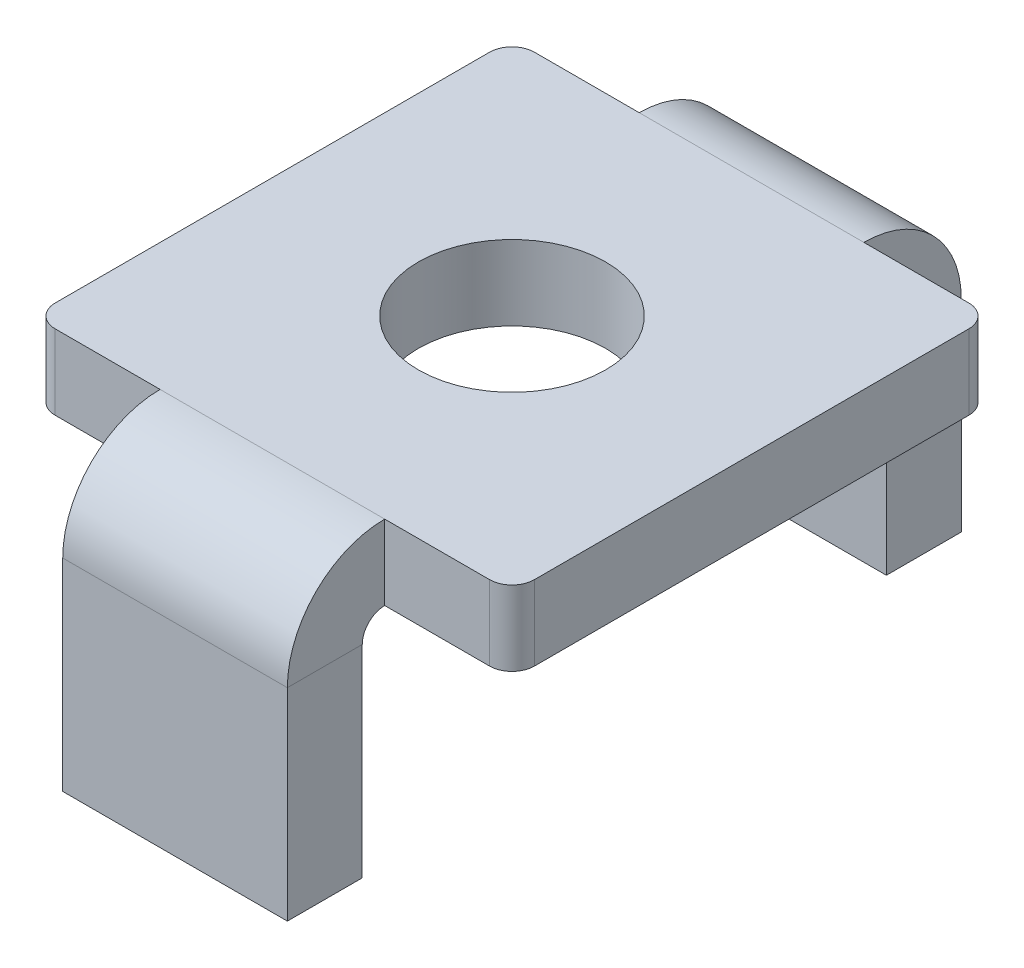
ISO-10303-21;
HEADER;
FILE_DESCRIPTION(('STEP AP214'),'2;1');
FILE_NAME('part.step','',(''),(''),'','','');
FILE_SCHEMA(('AUTOMOTIVE_DESIGN { 1 0 10303 214 1 1 1 1 }'));
ENDSEC;
DATA;
#1=APPLICATION_CONTEXT('core data for automotive mechanical design processes');
#2=APPLICATION_PROTOCOL_DEFINITION('international standard','automotive_design',2000,#1);
#3=PRODUCT_CONTEXT('',#1,'mechanical');
#4=PRODUCT('Part','Part','',(#3));
#5=PRODUCT_RELATED_PRODUCT_CATEGORY('part','',(#4));
#6=PRODUCT_DEFINITION_FORMATION('','',#4);
#7=PRODUCT_DEFINITION_CONTEXT('part definition',#1,'design');
#8=PRODUCT_DEFINITION('design','',#6,#7);
#9=PRODUCT_DEFINITION_SHAPE('','',#8);
#10=(LENGTH_UNIT() NAMED_UNIT(*) SI_UNIT(.MILLI.,.METRE.));
#11=(NAMED_UNIT(*) PLANE_ANGLE_UNIT() SI_UNIT($,.RADIAN.));
#12=(NAMED_UNIT(*) SI_UNIT($,.STERADIAN.) SOLID_ANGLE_UNIT());
#13=UNCERTAINTY_MEASURE_WITH_UNIT(LENGTH_MEASURE(1.E-05),#10,'distance_accuracy_value','');
#14=(GEOMETRIC_REPRESENTATION_CONTEXT(3) GLOBAL_UNCERTAINTY_ASSIGNED_CONTEXT((#13)) GLOBAL_UNIT_ASSIGNED_CONTEXT((#10,
#11,#12)) REPRESENTATION_CONTEXT('',''));
#15=CARTESIAN_POINT('',(0.,0.,0.));
#16=DIRECTION('',(0.,0.,1.));
#17=DIRECTION('',(1.,0.,0.));
#18=AXIS2_PLACEMENT_3D('',#15,#16,#17);
#19=CARTESIAN_POINT('',(-3.2,0.,-3.2));
#20=DIRECTION('',(0.,0.,-1.));
#21=DIRECTION('',(-1.,0.,0.));
#22=AXIS2_PLACEMENT_3D('',#19,#20,#21);
#23=PLANE('',#22);
#24=DIRECTION('',(1.,0.,0.));
#25=VECTOR('',#24,1.);
#26=CARTESIAN_POINT('',(0.,1.,-3.2));
#27=LINE('',#26,#25);
#28=CARTESIAN_POINT('',(2.9,1.,-3.2));
#29=VERTEX_POINT('',#28);
#30=CARTESIAN_POINT('',(1.5,1.,-3.2));
#31=VERTEX_POINT('',#30);
#32=EDGE_CURVE('E338',#29,#31,#27,.F.);
#33=ORIENTED_EDGE('',*,*,#32,.F.);
#34=DIRECTION('',(0.,-1.,0.));
#35=VECTOR('',#34,1.);
#36=CARTESIAN_POINT('',(2.9,0.,-3.2));
#37=LINE('',#36,#35);
#38=CARTESIAN_POINT('',(2.9,0.,-3.2));
#39=VERTEX_POINT('',#38);
#40=EDGE_CURVE('E384',#29,#39,#37,.T.);
#41=ORIENTED_EDGE('',*,*,#40,.T.);
#42=DIRECTION('',(-1.,0.,0.));
#43=VECTOR('',#42,1.);
#44=CARTESIAN_POINT('',(-3.2,0.,-3.2));
#45=LINE('',#44,#43);
#46=CARTESIAN_POINT('',(1.5,0.,-3.2));
#47=VERTEX_POINT('',#46);
#48=EDGE_CURVE('E348',#39,#47,#45,.T.);
#49=ORIENTED_EDGE('',*,*,#48,.T.);
#50=DIRECTION('',(0.,1.,0.));
#51=VECTOR('',#50,1.);
#52=CARTESIAN_POINT('',(1.5,0.,-3.2));
#53=LINE('',#52,#51);
#54=EDGE_CURVE('E266',#47,#31,#53,.T.);
#55=ORIENTED_EDGE('',*,*,#54,.T.);
#56=EDGE_LOOP('',(#33,#41,#49,#55));
#57=FACE_BOUND('',#56,.T.);
#58=ADVANCED_FACE('F78',(#57),#23,.T.);
#59=CARTESIAN_POINT('',(-3.2,0.,3.2));
#60=DIRECTION('',(0.,0.,1.));
#61=DIRECTION('',(1.,0.,0.));
#62=AXIS2_PLACEMENT_3D('',#59,#60,#61);
#63=PLANE('',#62);
#64=DIRECTION('',(1.,0.,0.));
#65=VECTOR('',#64,1.);
#66=CARTESIAN_POINT('',(0.,1.,3.2));
#67=LINE('',#66,#65);
#68=CARTESIAN_POINT('',(-2.9,1.,3.2));
#69=VERTEX_POINT('',#68);
#70=CARTESIAN_POINT('',(-1.5,1.,3.2));
#71=VERTEX_POINT('',#70);
#72=EDGE_CURVE('E361',#69,#71,#67,.T.);
#73=ORIENTED_EDGE('',*,*,#72,.F.);
#74=DIRECTION('',(0.,-1.,0.));
#75=VECTOR('',#74,1.);
#76=CARTESIAN_POINT('',(-2.9,0.,3.2));
#77=LINE('',#76,#75);
#78=CARTESIAN_POINT('',(-2.9,0.,3.2));
#79=VERTEX_POINT('',#78);
#80=EDGE_CURVE('E13',#69,#79,#77,.T.);
#81=ORIENTED_EDGE('',*,*,#80,.T.);
#82=DIRECTION('',(1.,0.,0.));
#83=VECTOR('',#82,1.);
#84=CARTESIAN_POINT('',(-3.2,0.,3.2));
#85=LINE('',#84,#83);
#86=CARTESIAN_POINT('',(-1.5,0.,3.2));
#87=VERTEX_POINT('',#86);
#88=EDGE_CURVE('E342',#79,#87,#85,.T.);
#89=ORIENTED_EDGE('',*,*,#88,.T.);
#90=DIRECTION('',(0.,1.,0.));
#91=VECTOR('',#90,1.);
#92=CARTESIAN_POINT('',(-1.5,0.,3.2));
#93=LINE('',#92,#91);
#94=EDGE_CURVE('E319',#87,#71,#93,.T.);
#95=ORIENTED_EDGE('',*,*,#94,.T.);
#96=EDGE_LOOP('',(#73,#81,#89,#95));
#97=FACE_BOUND('',#96,.T.);
#98=ADVANCED_FACE('F449',(#97),#63,.T.);
#99=CARTESIAN_POINT('',(-3.2,0.,-3.2));
#100=DIRECTION('',(-1.,0.,0.));
#101=DIRECTION('',(0.,0.,1.));
#102=AXIS2_PLACEMENT_3D('',#99,#100,#101);
#103=PLANE('',#102);
#104=DIRECTION('',(0.,0.,1.));
#105=VECTOR('',#104,1.);
#106=CARTESIAN_POINT('',(-3.2,1.,0.));
#107=LINE('',#106,#105);
#108=CARTESIAN_POINT('',(-3.2,1.,-2.9));
#109=VERTEX_POINT('',#108);
#110=CARTESIAN_POINT('',(-3.2,1.,2.9));
#111=VERTEX_POINT('',#110);
#112=EDGE_CURVE('E359',#109,#111,#107,.T.);
#113=ORIENTED_EDGE('',*,*,#112,.F.);
#114=DIRECTION('',(0.,-1.,0.));
#115=VECTOR('',#114,1.);
#116=CARTESIAN_POINT('',(-3.2,0.,-2.9));
#117=LINE('',#116,#115);
#118=CARTESIAN_POINT('',(-3.2,0.,-2.9));
#119=VERTEX_POINT('',#118);
#120=EDGE_CURVE('E364',#109,#119,#117,.T.);
#121=ORIENTED_EDGE('',*,*,#120,.T.);
#122=DIRECTION('',(0.,0.,1.));
#123=VECTOR('',#122,1.);
#124=CARTESIAN_POINT('',(-3.2,0.,-3.2));
#125=LINE('',#124,#123);
#126=CARTESIAN_POINT('',(-3.2,0.,2.9));
#127=VERTEX_POINT('',#126);
#128=EDGE_CURVE('E344',#119,#127,#125,.T.);
#129=ORIENTED_EDGE('',*,*,#128,.T.);
#130=DIRECTION('',(0.,-1.,0.));
#131=VECTOR('',#130,1.);
#132=CARTESIAN_POINT('',(-3.2,0.,2.9));
#133=LINE('',#132,#131);
#134=EDGE_CURVE('E350',#127,#111,#133,.F.);
#135=ORIENTED_EDGE('',*,*,#134,.T.);
#136=EDGE_LOOP('',(#113,#121,#129,#135));
#137=FACE_BOUND('',#136,.T.);
#138=ADVANCED_FACE('F454',(#137),#103,.T.);
#139=CARTESIAN_POINT('',(-1.5,0.,-3.2));
#140=VERTEX_POINT('',#139);
#141=CARTESIAN_POINT('',(-2.9,0.,-3.2));
#142=VERTEX_POINT('',#141);
#143=EDGE_CURVE('E347',#140,#142,#45,.T.);
#144=ORIENTED_EDGE('',*,*,#143,.T.);
#145=DIRECTION('',(0.,-1.,0.));
#146=VECTOR('',#145,1.);
#147=CARTESIAN_POINT('',(-2.9,0.,-3.2));
#148=LINE('',#147,#146);
#149=CARTESIAN_POINT('',(-2.9,1.,-3.2));
#150=VERTEX_POINT('',#149);
#151=EDGE_CURVE('E375',#142,#150,#148,.F.);
#152=ORIENTED_EDGE('',*,*,#151,.T.);
#153=CARTESIAN_POINT('',(-1.5,1.,-3.2));
#154=VERTEX_POINT('',#153);
#155=EDGE_CURVE('E358',#154,#150,#27,.F.);
#156=ORIENTED_EDGE('',*,*,#155,.F.);
#157=DIRECTION('',(0.,1.,0.));
#158=VECTOR('',#157,1.);
#159=CARTESIAN_POINT('',(-1.5,0.,-3.2));
#160=LINE('',#159,#158);
#161=EDGE_CURVE('E277',#140,#154,#160,.T.);
#162=ORIENTED_EDGE('',*,*,#161,.F.);
#163=EDGE_LOOP('',(#144,#152,#156,#162));
#164=FACE_BOUND('',#163,.T.);
#165=ADVANCED_FACE('F425',(#164),#23,.T.);
#166=CARTESIAN_POINT('',(3.2,0.,-3.2));
#167=DIRECTION('',(1.,0.,0.));
#168=DIRECTION('',(0.,0.,-1.));
#169=AXIS2_PLACEMENT_3D('',#166,#167,#168);
#170=PLANE('',#169);
#171=DIRECTION('',(0.,0.,-1.));
#172=VECTOR('',#171,1.);
#173=CARTESIAN_POINT('',(3.2,0.,-3.2));
#174=LINE('',#173,#172);
#175=CARTESIAN_POINT('',(3.2,0.,2.9));
#176=VERTEX_POINT('',#175);
#177=CARTESIAN_POINT('',(3.2,0.,-2.9));
#178=VERTEX_POINT('',#177);
#179=EDGE_CURVE('E337',#176,#178,#174,.T.);
#180=ORIENTED_EDGE('',*,*,#179,.T.);
#181=DIRECTION('',(0.,-1.,0.));
#182=VECTOR('',#181,1.);
#183=CARTESIAN_POINT('',(3.2,0.,-2.9));
#184=LINE('',#183,#182);
#185=CARTESIAN_POINT('',(3.2,1.,-2.9));
#186=VERTEX_POINT('',#185);
#187=EDGE_CURVE('E390',#178,#186,#184,.F.);
#188=ORIENTED_EDGE('',*,*,#187,.T.);
#189=DIRECTION('',(0.,0.,1.));
#190=VECTOR('',#189,1.);
#191=CARTESIAN_POINT('',(3.2,1.,0.));
#192=LINE('',#191,#190);
#193=CARTESIAN_POINT('',(3.2,1.,2.9));
#194=VERTEX_POINT('',#193);
#195=EDGE_CURVE('E353',#194,#186,#192,.F.);
#196=ORIENTED_EDGE('',*,*,#195,.F.);
#197=DIRECTION('',(0.,-1.,0.));
#198=VECTOR('',#197,1.);
#199=CARTESIAN_POINT('',(3.2,0.,2.9));
#200=LINE('',#199,#198);
#201=EDGE_CURVE('E387',#194,#176,#200,.T.);
#202=ORIENTED_EDGE('',*,*,#201,.T.);
#203=EDGE_LOOP('',(#180,#188,#196,#202));
#204=FACE_BOUND('',#203,.T.);
#205=ADVANCED_FACE('F394',(#204),#170,.T.);
#206=CARTESIAN_POINT('',(0.,0.,0.));
#207=DIRECTION('',(0.,1.,0.));
#208=DIRECTION('',(0.,0.,1.));
#209=AXIS2_PLACEMENT_3D('',#206,#207,#208);
#210=CYLINDRICAL_SURFACE('',#209,1.25);
#211=CARTESIAN_POINT('',(0.,0.,0.));
#212=DIRECTION('',(0.,1.,0.));
#213=DIRECTION('',(0.,0.,1.));
#214=AXIS2_PLACEMENT_3D('',#211,#212,#213);
#215=CIRCLE('',#214,1.25);
#216=CARTESIAN_POINT('',(0.,0.,1.25));
#217=VERTEX_POINT('',#216);
#218=EDGE_CURVE('E334',#217,#217,#215,.T.);
#219=ORIENTED_EDGE('',*,*,#218,.F.);
#220=EDGE_LOOP('',(#219));
#221=FACE_BOUND('',#220,.T.);
#222=CARTESIAN_POINT('',(0.,1.,0.));
#223=DIRECTION('',(0.,1.,0.));
#224=DIRECTION('',(0.,0.,1.));
#225=AXIS2_PLACEMENT_3D('',#222,#223,#224);
#226=CIRCLE('',#225,1.25);
#227=CARTESIAN_POINT('',(0.,1.,1.25));
#228=VERTEX_POINT('',#227);
#229=EDGE_CURVE('E331',#228,#228,#226,.T.);
#230=ORIENTED_EDGE('',*,*,#229,.T.);
#231=EDGE_LOOP('',(#230));
#232=FACE_BOUND('',#231,.T.);
#233=ADVANCED_FACE('F465',(#221,#232),#210,.F.);
#234=CARTESIAN_POINT('',(1.5,0.,3.2));
#235=VERTEX_POINT('',#234);
#236=CARTESIAN_POINT('',(2.9,0.,3.2));
#237=VERTEX_POINT('',#236);
#238=EDGE_CURVE('E341',#235,#237,#85,.T.);
#239=ORIENTED_EDGE('',*,*,#238,.T.);
#240=DIRECTION('',(0.,-1.,0.));
#241=VECTOR('',#240,1.);
#242=CARTESIAN_POINT('',(2.9,0.,3.2));
#243=LINE('',#242,#241);
#244=CARTESIAN_POINT('',(2.9,1.,3.2));
#245=VERTEX_POINT('',#244);
#246=EDGE_CURVE('E86',#237,#245,#243,.F.);
#247=ORIENTED_EDGE('',*,*,#246,.T.);
#248=CARTESIAN_POINT('',(1.5,1.,3.2));
#249=VERTEX_POINT('',#248);
#250=EDGE_CURVE('E356',#249,#245,#67,.T.);
#251=ORIENTED_EDGE('',*,*,#250,.F.);
#252=DIRECTION('',(0.,1.,0.));
#253=VECTOR('',#252,1.);
#254=CARTESIAN_POINT('',(1.5,0.,3.2));
#255=LINE('',#254,#253);
#256=EDGE_CURVE('E329',#235,#249,#255,.T.);
#257=ORIENTED_EDGE('',*,*,#256,.F.);
#258=EDGE_LOOP('',(#239,#247,#251,#257));
#259=FACE_BOUND('',#258,.T.);
#260=ADVANCED_FACE('F457',(#259),#63,.T.);
#261=CARTESIAN_POINT('',(0.,0.,0.));
#262=DIRECTION('',(0.,1.,0.));
#263=DIRECTION('',(0.,0.,1.));
#264=AXIS2_PLACEMENT_3D('',#261,#262,#263);
#265=PLANE('',#264);
#266=ORIENTED_EDGE('',*,*,#218,.T.);
#267=EDGE_LOOP('',(#266));
#268=FACE_BOUND('',#267,.T.);
#269=ORIENTED_EDGE('',*,*,#128,.F.);
#270=CARTESIAN_POINT('',(-2.9,0.,-2.9));
#271=DIRECTION('',(0.,1.,0.));
#272=DIRECTION('',(0.,0.,1.));
#273=AXIS2_PLACEMENT_3D('',#270,#271,#272);
#274=CIRCLE('',#273,0.3);
#275=EDGE_CURVE('E373',#119,#142,#274,.F.);
#276=ORIENTED_EDGE('',*,*,#275,.T.);
#277=ORIENTED_EDGE('',*,*,#143,.F.);
#278=DIRECTION('',(1.,0.,0.));
#279=VECTOR('',#278,1.);
#280=CARTESIAN_POINT('',(1.5,0.,-3.2));
#281=LINE('',#280,#279);
#282=EDGE_CURVE('E272',#47,#140,#281,.F.);
#283=ORIENTED_EDGE('',*,*,#282,.F.);
#284=ORIENTED_EDGE('',*,*,#48,.F.);
#285=CARTESIAN_POINT('',(2.9,0.,-2.9));
#286=DIRECTION('',(0.,1.,0.));
#287=DIRECTION('',(0.,0.,1.));
#288=AXIS2_PLACEMENT_3D('',#285,#286,#287);
#289=CIRCLE('',#288,0.3);
#290=EDGE_CURVE('E371',#39,#178,#289,.F.);
#291=ORIENTED_EDGE('',*,*,#290,.T.);
#292=ORIENTED_EDGE('',*,*,#179,.F.);
#293=CARTESIAN_POINT('',(2.9,0.,2.9));
#294=DIRECTION('',(0.,1.,0.));
#295=DIRECTION('',(0.,0.,1.));
#296=AXIS2_PLACEMENT_3D('',#293,#294,#295);
#297=CIRCLE('',#296,0.3);
#298=EDGE_CURVE('E369',#176,#237,#297,.F.);
#299=ORIENTED_EDGE('',*,*,#298,.T.);
#300=ORIENTED_EDGE('',*,*,#238,.F.);
#301=DIRECTION('',(-1.,0.,0.));
#302=VECTOR('',#301,1.);
#303=CARTESIAN_POINT('',(-1.5,0.,3.2));
#304=LINE('',#303,#302);
#305=EDGE_CURVE('E325',#87,#235,#304,.F.);
#306=ORIENTED_EDGE('',*,*,#305,.F.);
#307=ORIENTED_EDGE('',*,*,#88,.F.);
#308=CARTESIAN_POINT('',(-2.9,0.,2.9));
#309=DIRECTION('',(0.,1.,0.));
#310=DIRECTION('',(0.,0.,1.));
#311=AXIS2_PLACEMENT_3D('',#308,#309,#310);
#312=CIRCLE('',#311,0.3);
#313=EDGE_CURVE('E367',#79,#127,#312,.F.);
#314=ORIENTED_EDGE('',*,*,#313,.T.);
#315=EDGE_LOOP('',(#269,#276,#277,#283,#284,#291,#292,#299,#300,#306,#307,#314));
#316=FACE_BOUND('',#315,.T.);
#317=ADVANCED_FACE('F411',(#268,#316),#265,.F.);
#318=CARTESIAN_POINT('',(0.,1.,0.));
#319=DIRECTION('',(0.,1.,0.));
#320=DIRECTION('',(0.,0.,1.));
#321=AXIS2_PLACEMENT_3D('',#318,#319,#320);
#322=PLANE('',#321);
#323=ORIENTED_EDGE('',*,*,#229,.F.);
#324=EDGE_LOOP('',(#323));
#325=FACE_BOUND('',#324,.T.);
#326=ORIENTED_EDGE('',*,*,#155,.T.);
#327=CARTESIAN_POINT('',(-2.9,1.,-2.9));
#328=DIRECTION('',(0.,1.,0.));
#329=DIRECTION('',(0.,0.,1.));
#330=AXIS2_PLACEMENT_3D('',#327,#328,#329);
#331=CIRCLE('',#330,0.3);
#332=EDGE_CURVE('E382',#150,#109,#331,.T.);
#333=ORIENTED_EDGE('',*,*,#332,.T.);
#334=ORIENTED_EDGE('',*,*,#112,.T.);
#335=CARTESIAN_POINT('',(-2.9,1.,2.9));
#336=DIRECTION('',(0.,1.,0.));
#337=DIRECTION('',(0.,0.,1.));
#338=AXIS2_PLACEMENT_3D('',#335,#336,#337);
#339=CIRCLE('',#338,0.3);
#340=EDGE_CURVE('E100',#111,#69,#339,.T.);
#341=ORIENTED_EDGE('',*,*,#340,.T.);
#342=ORIENTED_EDGE('',*,*,#72,.T.);
#343=DIRECTION('',(-1.,0.,0.));
#344=VECTOR('',#343,1.);
#345=CARTESIAN_POINT('',(-1.5,1.,3.2));
#346=LINE('',#345,#344);
#347=EDGE_CURVE('E312',#71,#249,#346,.F.);
#348=ORIENTED_EDGE('',*,*,#347,.T.);
#349=ORIENTED_EDGE('',*,*,#250,.T.);
#350=CARTESIAN_POINT('',(2.9,1.,2.9));
#351=DIRECTION('',(0.,1.,0.));
#352=DIRECTION('',(0.,0.,1.));
#353=AXIS2_PLACEMENT_3D('',#350,#351,#352);
#354=CIRCLE('',#353,0.3);
#355=EDGE_CURVE('E378',#245,#194,#354,.T.);
#356=ORIENTED_EDGE('',*,*,#355,.T.);
#357=ORIENTED_EDGE('',*,*,#195,.T.);
#358=CARTESIAN_POINT('',(2.9,1.,-2.9));
#359=DIRECTION('',(0.,1.,0.));
#360=DIRECTION('',(0.,0.,1.));
#361=AXIS2_PLACEMENT_3D('',#358,#359,#360);
#362=CIRCLE('',#361,0.3);
#363=EDGE_CURVE('E380',#186,#29,#362,.T.);
#364=ORIENTED_EDGE('',*,*,#363,.T.);
#365=ORIENTED_EDGE('',*,*,#32,.T.);
#366=DIRECTION('',(1.,0.,0.));
#367=VECTOR('',#366,1.);
#368=CARTESIAN_POINT('',(1.5,1.,-3.2));
#369=LINE('',#368,#367);
#370=EDGE_CURVE('E259',#31,#154,#369,.F.);
#371=ORIENTED_EDGE('',*,*,#370,.T.);
#372=EDGE_LOOP('',(#326,#333,#334,#341,#342,#348,#349,#356,#357,#364,#365,#371));
#373=FACE_BOUND('',#372,.T.);
#374=ADVANCED_FACE('F400',(#325,#373),#322,.T.);
#375=CARTESIAN_POINT('',(1.5,-0.299999999999998,3.2));
#376=DIRECTION('',(1.,0.,0.));
#377=DIRECTION('',(0.,0.,-1.));
#378=AXIS2_PLACEMENT_3D('',#375,#376,#377);
#379=PLANE('',#378);
#380=DIRECTION('',(0.,0.,-1.));
#381=VECTOR('',#380,1.);
#382=CARTESIAN_POINT('',(1.5,-0.299999999999998,4.5));
#383=LINE('',#382,#381);
#384=CARTESIAN_POINT('',(1.5,-0.299999999999997,3.5));
#385=VERTEX_POINT('',#384);
#386=CARTESIAN_POINT('',(1.5,-0.299999999999994,4.5));
#387=VERTEX_POINT('',#386);
#388=EDGE_CURVE('E279',#385,#387,#383,.F.);
#389=ORIENTED_EDGE('',*,*,#388,.F.);
#390=CARTESIAN_POINT('',(1.5,-0.299999999999998,3.2));
#391=DIRECTION('',(-1.,0.,0.));
#392=DIRECTION('',(0.,0.,1.));
#393=AXIS2_PLACEMENT_3D('',#390,#391,#392);
#394=CIRCLE('',#393,0.3);
#395=EDGE_CURVE('E322',#235,#385,#394,.F.);
#396=ORIENTED_EDGE('',*,*,#395,.F.);
#397=ORIENTED_EDGE('',*,*,#256,.T.);
#398=CARTESIAN_POINT('',(1.5,-0.299999999999998,3.2));
#399=DIRECTION('',(-1.,0.,0.));
#400=DIRECTION('',(0.,0.,1.));
#401=AXIS2_PLACEMENT_3D('',#398,#399,#400);
#402=CIRCLE('',#401,1.3);
#403=EDGE_CURVE('E315',#249,#387,#402,.F.);
#404=ORIENTED_EDGE('',*,*,#403,.T.);
#405=EDGE_LOOP('',(#389,#396,#397,#404));
#406=FACE_BOUND('',#405,.T.);
#407=ADVANCED_FACE('F489',(#406),#379,.T.);
#408=CARTESIAN_POINT('',(-1.5,-0.299999999999998,3.2));
#409=DIRECTION('',(1.,0.,0.));
#410=DIRECTION('',(0.,0.,-1.));
#411=AXIS2_PLACEMENT_3D('',#408,#409,#410);
#412=PLANE('',#411);
#413=CARTESIAN_POINT('',(-1.5,-0.299999999999998,3.2));
#414=DIRECTION('',(-1.,0.,0.));
#415=DIRECTION('',(0.,0.,1.));
#416=AXIS2_PLACEMENT_3D('',#413,#414,#415);
#417=CIRCLE('',#416,0.3);
#418=CARTESIAN_POINT('',(-1.5,-0.299999999999997,3.5));
#419=VERTEX_POINT('',#418);
#420=EDGE_CURVE('E285',#419,#87,#417,.T.);
#421=ORIENTED_EDGE('',*,*,#420,.F.);
#422=DIRECTION('',(0.,0.,-1.));
#423=VECTOR('',#422,1.);
#424=CARTESIAN_POINT('',(-1.5,-0.299999999999998,3.5));
#425=LINE('',#424,#423);
#426=CARTESIAN_POINT('',(-1.5,-0.299999999999998,4.5));
#427=VERTEX_POINT('',#426);
#428=EDGE_CURVE('E305',#419,#427,#425,.F.);
#429=ORIENTED_EDGE('',*,*,#428,.T.);
#430=CARTESIAN_POINT('',(-1.5,-0.299999999999998,3.2));
#431=DIRECTION('',(-1.,0.,0.));
#432=DIRECTION('',(0.,0.,1.));
#433=AXIS2_PLACEMENT_3D('',#430,#431,#432);
#434=CIRCLE('',#433,1.3);
#435=EDGE_CURVE('E316',#427,#71,#434,.T.);
#436=ORIENTED_EDGE('',*,*,#435,.T.);
#437=ORIENTED_EDGE('',*,*,#94,.F.);
#438=EDGE_LOOP('',(#421,#429,#436,#437));
#439=FACE_BOUND('',#438,.T.);
#440=ADVANCED_FACE('F533',(#439),#412,.F.);
#441=CARTESIAN_POINT('',(-1.5,-0.299999999999998,3.2));
#442=DIRECTION('',(-1.,0.,0.));
#443=DIRECTION('',(0.,0.,1.));
#444=AXIS2_PLACEMENT_3D('',#441,#442,#443);
#445=CYLINDRICAL_SURFACE('',#444,1.3);
#446=ORIENTED_EDGE('',*,*,#347,.F.);
#447=ORIENTED_EDGE('',*,*,#435,.F.);
#448=DIRECTION('',(-1.,0.,0.));
#449=VECTOR('',#448,1.);
#450=CARTESIAN_POINT('',(1.5,-0.299999999999998,4.5));
#451=LINE('',#450,#449);
#452=EDGE_CURVE('E303',#427,#387,#451,.F.);
#453=ORIENTED_EDGE('',*,*,#452,.T.);
#454=ORIENTED_EDGE('',*,*,#403,.F.);
#455=EDGE_LOOP('',(#446,#447,#453,#454));
#456=FACE_BOUND('',#455,.T.);
#457=ADVANCED_FACE('F492',(#456),#445,.T.);
#458=CARTESIAN_POINT('',(-1.5,-0.299999999999998,3.2));
#459=DIRECTION('',(-1.,0.,0.));
#460=DIRECTION('',(0.,0.,1.));
#461=AXIS2_PLACEMENT_3D('',#458,#459,#460);
#462=CYLINDRICAL_SURFACE('',#461,0.3);
#463=ORIENTED_EDGE('',*,*,#305,.T.);
#464=ORIENTED_EDGE('',*,*,#395,.T.);
#465=DIRECTION('',(-1.,0.,0.));
#466=VECTOR('',#465,1.);
#467=CARTESIAN_POINT('',(1.5,-0.299999999999998,3.5));
#468=LINE('',#467,#466);
#469=EDGE_CURVE('E308',#385,#419,#468,.T.);
#470=ORIENTED_EDGE('',*,*,#469,.T.);
#471=ORIENTED_EDGE('',*,*,#420,.T.);
#472=EDGE_LOOP('',(#463,#464,#470,#471));
#473=FACE_BOUND('',#472,.T.);
#474=ADVANCED_FACE('F513',(#473),#462,.F.);
#475=CARTESIAN_POINT('',(-1.5,-3.,4.50000000000001));
#476=DIRECTION('',(1.,0.,0.));
#477=DIRECTION('',(0.,0.,-1.));
#478=AXIS2_PLACEMENT_3D('',#475,#476,#477);
#479=PLANE('',#478);
#480=ORIENTED_EDGE('',*,*,#428,.F.);
#481=DIRECTION('',(0.,1.,0.));
#482=VECTOR('',#481,1.);
#483=CARTESIAN_POINT('',(-1.5,-3.,3.50000000000001));
#484=LINE('',#483,#482);
#485=CARTESIAN_POINT('',(-1.5,-3.,3.50000000000001));
#486=VERTEX_POINT('',#485);
#487=EDGE_CURVE('E301',#419,#486,#484,.F.);
#488=ORIENTED_EDGE('',*,*,#487,.T.);
#489=DIRECTION('',(0.,0.,-1.));
#490=VECTOR('',#489,1.);
#491=CARTESIAN_POINT('',(-1.5,-3.,4.50000000000001));
#492=LINE('',#491,#490);
#493=CARTESIAN_POINT('',(-1.5,-3.,4.50000000000001));
#494=VERTEX_POINT('',#493);
#495=EDGE_CURVE('E282',#494,#486,#492,.T.);
#496=ORIENTED_EDGE('',*,*,#495,.F.);
#497=DIRECTION('',(0.,-1.,0.));
#498=VECTOR('',#497,1.);
#499=CARTESIAN_POINT('',(-1.5,0.,4.5));
#500=LINE('',#499,#498);
#501=EDGE_CURVE('E294',#427,#494,#500,.T.);
#502=ORIENTED_EDGE('',*,*,#501,.F.);
#503=EDGE_LOOP('',(#480,#488,#496,#502));
#504=FACE_BOUND('',#503,.T.);
#505=ADVANCED_FACE('F502',(#504),#479,.F.);
#506=CARTESIAN_POINT('',(1.5,0.,4.5));
#507=DIRECTION('',(-1.,0.,0.));
#508=DIRECTION('',(0.,0.,1.));
#509=AXIS2_PLACEMENT_3D('',#506,#507,#508);
#510=PLANE('',#509);
#511=ORIENTED_EDGE('',*,*,#388,.T.);
#512=DIRECTION('',(0.,1.,0.));
#513=VECTOR('',#512,1.);
#514=CARTESIAN_POINT('',(1.5,0.,4.5));
#515=LINE('',#514,#513);
#516=CARTESIAN_POINT('',(1.5,-3.,4.50000000000001));
#517=VERTEX_POINT('',#516);
#518=EDGE_CURVE('E289',#517,#387,#515,.T.);
#519=ORIENTED_EDGE('',*,*,#518,.F.);
#520=DIRECTION('',(0.,0.,-1.));
#521=VECTOR('',#520,1.);
#522=CARTESIAN_POINT('',(1.5,-3.,4.50000000000001));
#523=LINE('',#522,#521);
#524=CARTESIAN_POINT('',(1.5,-3.,3.50000000000001));
#525=VERTEX_POINT('',#524);
#526=EDGE_CURVE('E286',#517,#525,#523,.T.);
#527=ORIENTED_EDGE('',*,*,#526,.T.);
#528=DIRECTION('',(0.,-1.,0.));
#529=VECTOR('',#528,1.);
#530=CARTESIAN_POINT('',(1.5,0.,3.5));
#531=LINE('',#530,#529);
#532=EDGE_CURVE('E296',#525,#385,#531,.F.);
#533=ORIENTED_EDGE('',*,*,#532,.T.);
#534=EDGE_LOOP('',(#511,#519,#527,#533));
#535=FACE_BOUND('',#534,.T.);
#536=ADVANCED_FACE('F510',(#535),#510,.F.);
#537=CARTESIAN_POINT('',(0.,0.,4.5));
#538=DIRECTION('',(0.,0.,-1.));
#539=DIRECTION('',(0.,1.,0.));
#540=AXIS2_PLACEMENT_3D('',#537,#538,#539);
#541=PLANE('',#540);
#542=ORIENTED_EDGE('',*,*,#452,.F.);
#543=ORIENTED_EDGE('',*,*,#501,.T.);
#544=DIRECTION('',(1.,0.,0.));
#545=VECTOR('',#544,1.);
#546=CARTESIAN_POINT('',(0.,-3.,4.50000000000001));
#547=LINE('',#546,#545);
#548=EDGE_CURVE('E292',#494,#517,#547,.T.);
#549=ORIENTED_EDGE('',*,*,#548,.T.);
#550=ORIENTED_EDGE('',*,*,#518,.T.);
#551=EDGE_LOOP('',(#542,#543,#549,#550));
#552=FACE_BOUND('',#551,.T.);
#553=ADVANCED_FACE('F496',(#552),#541,.F.);
#554=CARTESIAN_POINT('',(0.,0.,3.5));
#555=DIRECTION('',(0.,0.,-1.));
#556=DIRECTION('',(0.,1.,0.));
#557=AXIS2_PLACEMENT_3D('',#554,#555,#556);
#558=PLANE('',#557);
#559=ORIENTED_EDGE('',*,*,#487,.F.);
#560=ORIENTED_EDGE('',*,*,#469,.F.);
#561=ORIENTED_EDGE('',*,*,#532,.F.);
#562=DIRECTION('',(-1.,0.,0.));
#563=VECTOR('',#562,1.);
#564=CARTESIAN_POINT('',(1.5,-3.,3.50000000000001));
#565=LINE('',#564,#563);
#566=EDGE_CURVE('E299',#486,#525,#565,.F.);
#567=ORIENTED_EDGE('',*,*,#566,.F.);
#568=EDGE_LOOP('',(#559,#560,#561,#567));
#569=FACE_BOUND('',#568,.T.);
#570=ADVANCED_FACE('F516',(#569),#558,.T.);
#571=CARTESIAN_POINT('',(1.5,-3.,4.50000000000001));
#572=DIRECTION('',(0.,1.,0.));
#573=DIRECTION('',(0.,0.,1.));
#574=AXIS2_PLACEMENT_3D('',#571,#572,#573);
#575=PLANE('',#574);
#576=ORIENTED_EDGE('',*,*,#566,.T.);
#577=ORIENTED_EDGE('',*,*,#526,.F.);
#578=ORIENTED_EDGE('',*,*,#548,.F.);
#579=ORIENTED_EDGE('',*,*,#495,.T.);
#580=EDGE_LOOP('',(#576,#577,#578,#579));
#581=FACE_BOUND('',#580,.T.);
#582=ADVANCED_FACE('F506',(#581),#575,.F.);
#583=CARTESIAN_POINT('',(-1.5,-0.3,-3.2));
#584=DIRECTION('',(-1.,0.,0.));
#585=DIRECTION('',(0.,0.,1.));
#586=AXIS2_PLACEMENT_3D('',#583,#584,#585);
#587=PLANE('',#586);
#588=DIRECTION('',(0.,0.,-1.));
#589=VECTOR('',#588,1.);
#590=CARTESIAN_POINT('',(-1.5,-0.299999999999991,-4.49999999999999));
#591=LINE('',#590,#589);
#592=CARTESIAN_POINT('',(-1.5,-0.299999999999999,-3.5));
#593=VERTEX_POINT('',#592);
#594=CARTESIAN_POINT('',(-1.5,-0.299999999999996,-4.5));
#595=VERTEX_POINT('',#594);
#596=EDGE_CURVE('E224',#593,#595,#591,.T.);
#597=ORIENTED_EDGE('',*,*,#596,.F.);
#598=CARTESIAN_POINT('',(-1.5,-0.3,-3.2));
#599=DIRECTION('',(1.,0.,0.));
#600=DIRECTION('',(0.,0.,-1.));
#601=AXIS2_PLACEMENT_3D('',#598,#599,#600);
#602=CIRCLE('',#601,0.3);
#603=EDGE_CURVE('E269',#140,#593,#602,.F.);
#604=ORIENTED_EDGE('',*,*,#603,.F.);
#605=ORIENTED_EDGE('',*,*,#161,.T.);
#606=CARTESIAN_POINT('',(-1.5,-0.3,-3.2));
#607=DIRECTION('',(1.,0.,0.));
#608=DIRECTION('',(0.,0.,-1.));
#609=AXIS2_PLACEMENT_3D('',#606,#607,#608);
#610=CIRCLE('',#609,1.3);
#611=EDGE_CURVE('E262',#154,#595,#610,.F.);
#612=ORIENTED_EDGE('',*,*,#611,.T.);
#613=EDGE_LOOP('',(#597,#604,#605,#612));
#614=FACE_BOUND('',#613,.T.);
#615=ADVANCED_FACE('F421',(#614),#587,.T.);
#616=CARTESIAN_POINT('',(1.5,-0.3,-3.2));
#617=DIRECTION('',(-1.,0.,0.));
#618=DIRECTION('',(0.,0.,1.));
#619=AXIS2_PLACEMENT_3D('',#616,#617,#618);
#620=PLANE('',#619);
#621=CARTESIAN_POINT('',(1.5,-0.3,-3.2));
#622=DIRECTION('',(1.,0.,0.));
#623=DIRECTION('',(0.,0.,-1.));
#624=AXIS2_PLACEMENT_3D('',#621,#622,#623);
#625=CIRCLE('',#624,0.3);
#626=CARTESIAN_POINT('',(1.5,-0.299999999999999,-3.5));
#627=VERTEX_POINT('',#626);
#628=EDGE_CURVE('E274',#627,#47,#625,.T.);
#629=ORIENTED_EDGE('',*,*,#628,.F.);
#630=DIRECTION('',(0.,0.,-1.));
#631=VECTOR('',#630,1.);
#632=CARTESIAN_POINT('',(1.5,-0.299999999999998,-3.5));
#633=LINE('',#632,#631);
#634=CARTESIAN_POINT('',(1.5,-0.299999999999991,-4.5));
#635=VERTEX_POINT('',#634);
#636=EDGE_CURVE('E253',#627,#635,#633,.T.);
#637=ORIENTED_EDGE('',*,*,#636,.T.);
#638=CARTESIAN_POINT('',(1.5,-0.3,-3.2));
#639=DIRECTION('',(1.,0.,0.));
#640=DIRECTION('',(0.,0.,-1.));
#641=AXIS2_PLACEMENT_3D('',#638,#639,#640);
#642=CIRCLE('',#641,1.3);
#643=EDGE_CURVE('E263',#635,#31,#642,.T.);
#644=ORIENTED_EDGE('',*,*,#643,.T.);
#645=ORIENTED_EDGE('',*,*,#54,.F.);
#646=EDGE_LOOP('',(#629,#637,#644,#645));
#647=FACE_BOUND('',#646,.T.);
#648=ADVANCED_FACE('F432',(#647),#620,.F.);
#649=CARTESIAN_POINT('',(1.5,-0.3,-3.2));
#650=DIRECTION('',(1.,0.,0.));
#651=DIRECTION('',(0.,0.,-1.));
#652=AXIS2_PLACEMENT_3D('',#649,#650,#651);
#653=CYLINDRICAL_SURFACE('',#652,1.3);
#654=ORIENTED_EDGE('',*,*,#370,.F.);
#655=ORIENTED_EDGE('',*,*,#643,.F.);
#656=DIRECTION('',(1.,0.,0.));
#657=VECTOR('',#656,1.);
#658=CARTESIAN_POINT('',(-1.5,-0.299999999999991,-4.5));
#659=LINE('',#658,#657);
#660=EDGE_CURVE('E251',#635,#595,#659,.F.);
#661=ORIENTED_EDGE('',*,*,#660,.T.);
#662=ORIENTED_EDGE('',*,*,#611,.F.);
#663=EDGE_LOOP('',(#654,#655,#661,#662));
#664=FACE_BOUND('',#663,.T.);
#665=ADVANCED_FACE('F430',(#664),#653,.T.);
#666=CARTESIAN_POINT('',(1.5,-0.3,-3.2));
#667=DIRECTION('',(1.,0.,0.));
#668=DIRECTION('',(0.,0.,-1.));
#669=AXIS2_PLACEMENT_3D('',#666,#667,#668);
#670=CYLINDRICAL_SURFACE('',#669,0.3);
#671=ORIENTED_EDGE('',*,*,#282,.T.);
#672=ORIENTED_EDGE('',*,*,#603,.T.);
#673=DIRECTION('',(1.,0.,0.));
#674=VECTOR('',#673,1.);
#675=CARTESIAN_POINT('',(-1.5,-0.299999999999998,-3.5));
#676=LINE('',#675,#674);
#677=EDGE_CURVE('E256',#593,#627,#676,.T.);
#678=ORIENTED_EDGE('',*,*,#677,.T.);
#679=ORIENTED_EDGE('',*,*,#628,.T.);
#680=EDGE_LOOP('',(#671,#672,#678,#679));
#681=FACE_BOUND('',#680,.T.);
#682=ADVANCED_FACE('F416',(#681),#670,.F.);
#683=CARTESIAN_POINT('',(-1.5,-3.,-4.50000000000001));
#684=DIRECTION('',(-1.,0.,0.));
#685=DIRECTION('',(0.,0.,1.));
#686=AXIS2_PLACEMENT_3D('',#683,#684,#685);
#687=PLANE('',#686);
#688=DIRECTION('',(0.,-1.,0.));
#689=VECTOR('',#688,1.);
#690=CARTESIAN_POINT('',(-1.5,0.,-3.5));
#691=LINE('',#690,#689);
#692=CARTESIAN_POINT('',(-1.5,-3.,-3.50000000000001));
#693=VERTEX_POINT('',#692);
#694=EDGE_CURVE('E249',#593,#693,#691,.T.);
#695=ORIENTED_EDGE('',*,*,#694,.F.);
#696=ORIENTED_EDGE('',*,*,#596,.T.);
#697=DIRECTION('',(0.,1.,0.));
#698=VECTOR('',#697,1.);
#699=CARTESIAN_POINT('',(-1.5,-3.,-4.50000000000001));
#700=LINE('',#699,#698);
#701=CARTESIAN_POINT('',(-1.5,-3.,-4.50000000000001));
#702=VERTEX_POINT('',#701);
#703=EDGE_CURVE('E218',#595,#702,#700,.F.);
#704=ORIENTED_EDGE('',*,*,#703,.T.);
#705=DIRECTION('',(0.,0.,1.));
#706=VECTOR('',#705,1.);
#707=CARTESIAN_POINT('',(-1.5,-3.,-4.50000000000001));
#708=LINE('',#707,#706);
#709=EDGE_CURVE('E222',#702,#693,#708,.T.);
#710=ORIENTED_EDGE('',*,*,#709,.T.);
#711=EDGE_LOOP('',(#695,#696,#704,#710));
#712=FACE_BOUND('',#711,.T.);
#713=ADVANCED_FACE('F221',(#712),#687,.T.);
#714=CARTESIAN_POINT('',(1.5,0.,-4.5));
#715=DIRECTION('',(1.,0.,0.));
#716=DIRECTION('',(0.,0.,-1.));
#717=AXIS2_PLACEMENT_3D('',#714,#715,#716);
#718=PLANE('',#717);
#719=DIRECTION('',(0.,-1.,0.));
#720=VECTOR('',#719,1.);
#721=CARTESIAN_POINT('',(1.5,0.,-4.5));
#722=LINE('',#721,#720);
#723=CARTESIAN_POINT('',(1.5,-3.,-4.50000000000001));
#724=VERTEX_POINT('',#723);
#725=EDGE_CURVE('E228',#724,#635,#722,.F.);
#726=ORIENTED_EDGE('',*,*,#725,.T.);
#727=ORIENTED_EDGE('',*,*,#636,.F.);
#728=DIRECTION('',(0.,1.,0.));
#729=VECTOR('',#728,1.);
#730=CARTESIAN_POINT('',(1.5,0.,-3.5));
#731=LINE('',#730,#729);
#732=CARTESIAN_POINT('',(1.5,-3.,-3.50000000000001));
#733=VERTEX_POINT('',#732);
#734=EDGE_CURVE('E246',#733,#627,#731,.T.);
#735=ORIENTED_EDGE('',*,*,#734,.F.);
#736=DIRECTION('',(0.,0.,1.));
#737=VECTOR('',#736,1.);
#738=CARTESIAN_POINT('',(1.5,-3.,-4.50000000000001));
#739=LINE('',#738,#737);
#740=EDGE_CURVE('E236',#724,#733,#739,.T.);
#741=ORIENTED_EDGE('',*,*,#740,.F.);
#742=EDGE_LOOP('',(#726,#727,#735,#741));
#743=FACE_BOUND('',#742,.T.);
#744=ADVANCED_FACE('F436',(#743),#718,.T.);
#745=CARTESIAN_POINT('',(0.,0.,-4.5));
#746=DIRECTION('',(0.,0.,1.));
#747=DIRECTION('',(0.,1.,0.));
#748=AXIS2_PLACEMENT_3D('',#745,#746,#747);
#749=PLANE('',#748);
#750=ORIENTED_EDGE('',*,*,#660,.F.);
#751=ORIENTED_EDGE('',*,*,#725,.F.);
#752=DIRECTION('',(-1.,0.,0.));
#753=VECTOR('',#752,1.);
#754=CARTESIAN_POINT('',(1.5,-3.,-4.50000000000001));
#755=LINE('',#754,#753);
#756=EDGE_CURVE('E234',#702,#724,#755,.F.);
#757=ORIENTED_EDGE('',*,*,#756,.F.);
#758=ORIENTED_EDGE('',*,*,#703,.F.);
#759=EDGE_LOOP('',(#750,#751,#757,#758));
#760=FACE_BOUND('',#759,.T.);
#761=ADVANCED_FACE('F239',(#760),#749,.F.);
#762=CARTESIAN_POINT('',(0.,0.,-3.5));
#763=DIRECTION('',(0.,0.,1.));
#764=DIRECTION('',(0.,1.,0.));
#765=AXIS2_PLACEMENT_3D('',#762,#763,#764);
#766=PLANE('',#765);
#767=ORIENTED_EDGE('',*,*,#734,.T.);
#768=ORIENTED_EDGE('',*,*,#677,.F.);
#769=ORIENTED_EDGE('',*,*,#694,.T.);
#770=DIRECTION('',(1.,0.,0.));
#771=VECTOR('',#770,1.);
#772=CARTESIAN_POINT('',(0.,-3.,-3.50000000000001));
#773=LINE('',#772,#771);
#774=EDGE_CURVE('E229',#693,#733,#773,.T.);
#775=ORIENTED_EDGE('',*,*,#774,.T.);
#776=EDGE_LOOP('',(#767,#768,#769,#775));
#777=FACE_BOUND('',#776,.T.);
#778=ADVANCED_FACE('F438',(#777),#766,.T.);
#779=CARTESIAN_POINT('',(1.5,-3.,-4.50000000000001));
#780=DIRECTION('',(0.,-1.,0.));
#781=DIRECTION('',(0.,0.,-1.));
#782=AXIS2_PLACEMENT_3D('',#779,#780,#781);
#783=PLANE('',#782);
#784=ORIENTED_EDGE('',*,*,#774,.F.);
#785=ORIENTED_EDGE('',*,*,#709,.F.);
#786=ORIENTED_EDGE('',*,*,#756,.T.);
#787=ORIENTED_EDGE('',*,*,#740,.T.);
#788=EDGE_LOOP('',(#784,#785,#786,#787));
#789=FACE_BOUND('',#788,.T.);
#790=ADVANCED_FACE('F233',(#789),#783,.T.);
#791=CARTESIAN_POINT('',(-2.9,0.,-2.9));
#792=DIRECTION('',(0.,-1.,0.));
#793=DIRECTION('',(0.,0.,-1.));
#794=AXIS2_PLACEMENT_3D('',#791,#792,#793);
#795=CYLINDRICAL_SURFACE('',#794,0.3);
#796=ORIENTED_EDGE('',*,*,#332,.F.);
#797=ORIENTED_EDGE('',*,*,#151,.F.);
#798=ORIENTED_EDGE('',*,*,#275,.F.);
#799=ORIENTED_EDGE('',*,*,#120,.F.);
#800=EDGE_LOOP('',(#796,#797,#798,#799));
#801=FACE_BOUND('',#800,.T.);
#802=ADVANCED_FACE('F445',(#801),#795,.T.);
#803=CARTESIAN_POINT('',(2.9,0.,-2.9));
#804=DIRECTION('',(0.,-1.,0.));
#805=DIRECTION('',(0.,0.,-1.));
#806=AXIS2_PLACEMENT_3D('',#803,#804,#805);
#807=CYLINDRICAL_SURFACE('',#806,0.3);
#808=ORIENTED_EDGE('',*,*,#363,.F.);
#809=ORIENTED_EDGE('',*,*,#187,.F.);
#810=ORIENTED_EDGE('',*,*,#290,.F.);
#811=ORIENTED_EDGE('',*,*,#40,.F.);
#812=EDGE_LOOP('',(#808,#809,#810,#811));
#813=FACE_BOUND('',#812,.T.);
#814=ADVANCED_FACE('F404',(#813),#807,.T.);
#815=CARTESIAN_POINT('',(2.9,0.,2.9));
#816=DIRECTION('',(0.,-1.,0.));
#817=DIRECTION('',(0.,0.,-1.));
#818=AXIS2_PLACEMENT_3D('',#815,#816,#817);
#819=CYLINDRICAL_SURFACE('',#818,0.3);
#820=ORIENTED_EDGE('',*,*,#355,.F.);
#821=ORIENTED_EDGE('',*,*,#246,.F.);
#822=ORIENTED_EDGE('',*,*,#298,.F.);
#823=ORIENTED_EDGE('',*,*,#201,.F.);
#824=EDGE_LOOP('',(#820,#821,#822,#823));
#825=FACE_BOUND('',#824,.T.);
#826=ADVANCED_FACE('F476',(#825),#819,.T.);
#827=CARTESIAN_POINT('',(-2.9,0.,2.9));
#828=DIRECTION('',(0.,-1.,0.));
#829=DIRECTION('',(0.,0.,-1.));
#830=AXIS2_PLACEMENT_3D('',#827,#828,#829);
#831=CYLINDRICAL_SURFACE('',#830,0.3);
#832=ORIENTED_EDGE('',*,*,#340,.F.);
#833=ORIENTED_EDGE('',*,*,#134,.F.);
#834=ORIENTED_EDGE('',*,*,#313,.F.);
#835=ORIENTED_EDGE('',*,*,#80,.F.);
#836=EDGE_LOOP('',(#832,#833,#834,#835));
#837=FACE_BOUND('',#836,.T.);
#838=ADVANCED_FACE('F80',(#837),#831,.T.);
#839=CLOSED_SHELL('',(#58,#98,#138,#165,#205,#233,#260,#317,#374,#407,#440,#457,#474,#505,#536,
#553,#570,#582,#615,#648,#665,#682,#713,#744,#761,#778,#790,#802,#814,#826,#838));
#840=MANIFOLD_SOLID_BREP('B2',#839);
#841=ADVANCED_BREP_SHAPE_REPRESENTATION('',(#18,#840),#14);
#842=SHAPE_DEFINITION_REPRESENTATION(#9,#841);
ENDSEC;
END-ISO-10303-21;
